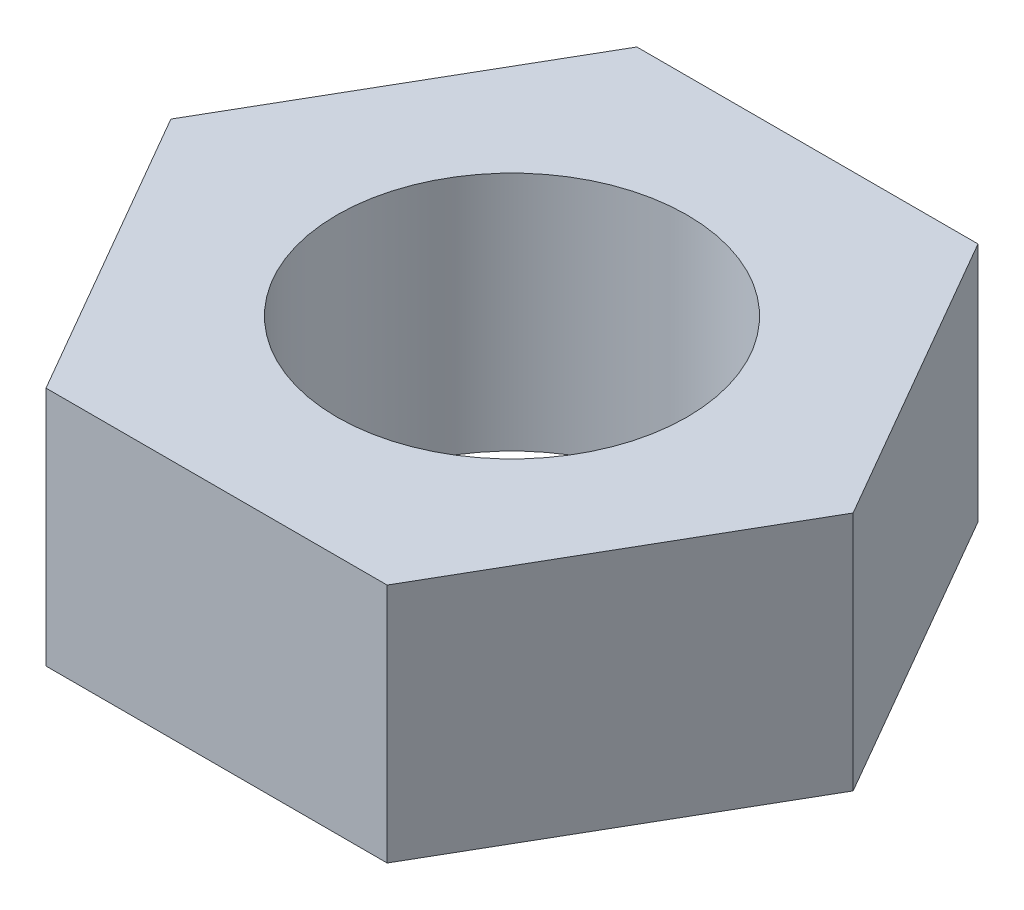
ISO-10303-21;
HEADER;
FILE_DESCRIPTION(('STEP AP214'),'2;1');
FILE_NAME('part.step','',(''),(''),'','','');
FILE_SCHEMA(('AUTOMOTIVE_DESIGN { 1 0 10303 214 1 1 1 1 }'));
ENDSEC;
DATA;
#1=APPLICATION_CONTEXT('core data for automotive mechanical design processes');
#2=APPLICATION_PROTOCOL_DEFINITION('international standard','automotive_design',2000,#1);
#3=PRODUCT_CONTEXT('',#1,'mechanical');
#4=PRODUCT('Part','Part','',(#3));
#5=PRODUCT_RELATED_PRODUCT_CATEGORY('part','',(#4));
#6=PRODUCT_DEFINITION_FORMATION('','',#4);
#7=PRODUCT_DEFINITION_CONTEXT('part definition',#1,'design');
#8=PRODUCT_DEFINITION('design','',#6,#7);
#9=PRODUCT_DEFINITION_SHAPE('','',#8);
#10=(LENGTH_UNIT() NAMED_UNIT(*) SI_UNIT(.MILLI.,.METRE.));
#11=(NAMED_UNIT(*) PLANE_ANGLE_UNIT() SI_UNIT($,.RADIAN.));
#12=(NAMED_UNIT(*) SI_UNIT($,.STERADIAN.) SOLID_ANGLE_UNIT());
#13=UNCERTAINTY_MEASURE_WITH_UNIT(LENGTH_MEASURE(1.E-05),#10,'distance_accuracy_value','');
#14=(GEOMETRIC_REPRESENTATION_CONTEXT(3) GLOBAL_UNCERTAINTY_ASSIGNED_CONTEXT((#13)) GLOBAL_UNIT_ASSIGNED_CONTEXT((#10,
#11,#12)) REPRESENTATION_CONTEXT('',''));
#15=CARTESIAN_POINT('',(0.,0.,0.));
#16=DIRECTION('',(0.,0.,1.));
#17=DIRECTION('',(1.,0.,0.));
#18=AXIS2_PLACEMENT_3D('',#15,#16,#17);
#19=CARTESIAN_POINT('',(0.,5.5,0.));
#20=DIRECTION('',(0.,1.,0.));
#21=DIRECTION('',(0.,0.,1.));
#22=AXIS2_PLACEMENT_3D('',#19,#20,#21);
#23=PLANE('',#22);
#24=DIRECTION('',(0.5,0.,-0.866025403784439));
#25=VECTOR('',#24,1.);
#26=CARTESIAN_POINT('',(3.89711431702997,5.5,6.75));
#27=LINE('',#26,#25);
#28=CARTESIAN_POINT('',(3.89711431702997,5.5,6.75));
#29=VERTEX_POINT('',#28);
#30=CARTESIAN_POINT('',(7.79422863405995,5.5,0.));
#31=VERTEX_POINT('',#30);
#32=EDGE_CURVE('E129',#29,#31,#27,.T.);
#33=ORIENTED_EDGE('',*,*,#32,.T.);
#34=DIRECTION('',(-0.5,0.,-0.866025403784439));
#35=VECTOR('',#34,1.);
#36=CARTESIAN_POINT('',(7.79422863405995,5.5,0.));
#37=LINE('',#36,#35);
#38=CARTESIAN_POINT('',(3.89711431702997,5.5,-6.75));
#39=VERTEX_POINT('',#38);
#40=EDGE_CURVE('E87',#31,#39,#37,.T.);
#41=ORIENTED_EDGE('',*,*,#40,.T.);
#42=DIRECTION('',(-1.,0.,0.));
#43=VECTOR('',#42,1.);
#44=CARTESIAN_POINT('',(3.89711431702997,5.5,-6.75));
#45=LINE('',#44,#43);
#46=CARTESIAN_POINT('',(-3.89711431702998,5.5,-6.75));
#47=VERTEX_POINT('',#46);
#48=EDGE_CURVE('E100',#39,#47,#45,.T.);
#49=ORIENTED_EDGE('',*,*,#48,.T.);
#50=DIRECTION('',(-0.5,0.,0.866025403784439));
#51=VECTOR('',#50,1.);
#52=CARTESIAN_POINT('',(-3.89711431702998,5.5,-6.75));
#53=LINE('',#52,#51);
#54=CARTESIAN_POINT('',(-7.79422863405995,5.5,0.));
#55=VERTEX_POINT('',#54);
#56=EDGE_CURVE('E94',#47,#55,#53,.T.);
#57=ORIENTED_EDGE('',*,*,#56,.T.);
#58=DIRECTION('',(0.5,0.,0.866025403784439));
#59=VECTOR('',#58,1.);
#60=CARTESIAN_POINT('',(-7.79422863405995,5.5,0.));
#61=LINE('',#60,#59);
#62=CARTESIAN_POINT('',(-3.89711431702997,5.5,6.75));
#63=VERTEX_POINT('',#62);
#64=EDGE_CURVE('E98',#55,#63,#61,.T.);
#65=ORIENTED_EDGE('',*,*,#64,.T.);
#66=DIRECTION('',(1.,0.,0.));
#67=VECTOR('',#66,1.);
#68=CARTESIAN_POINT('',(-3.89711431702997,5.5,6.75));
#69=LINE('',#68,#67);
#70=EDGE_CURVE('E50',#63,#29,#69,.T.);
#71=ORIENTED_EDGE('',*,*,#70,.T.);
#72=EDGE_LOOP('',(#33,#41,#49,#57,#65,#71));
#73=FACE_BOUND('',#72,.T.);
#74=CARTESIAN_POINT('',(0.,5.5,0.));
#75=DIRECTION('',(0.,1.,0.));
#76=DIRECTION('',(0.,0.,1.));
#77=AXIS2_PLACEMENT_3D('',#74,#75,#76);
#78=CIRCLE('',#77,4.);
#79=CARTESIAN_POINT('',(0.,5.5,4.));
#80=VERTEX_POINT('',#79);
#81=EDGE_CURVE('E122',#80,#80,#78,.T.);
#82=ORIENTED_EDGE('',*,*,#81,.F.);
#83=EDGE_LOOP('',(#82));
#84=FACE_BOUND('',#83,.T.);
#85=ADVANCED_FACE('F33',(#73,#84),#23,.T.);
#86=CARTESIAN_POINT('',(0.,0.,0.));
#87=DIRECTION('',(0.,1.,0.));
#88=DIRECTION('',(0.,0.,1.));
#89=AXIS2_PLACEMENT_3D('',#86,#87,#88);
#90=PLANE('',#89);
#91=DIRECTION('',(0.5,0.,-0.866025403784439));
#92=VECTOR('',#91,1.);
#93=CARTESIAN_POINT('',(3.89711431702997,0.,6.75));
#94=LINE('',#93,#92);
#95=CARTESIAN_POINT('',(3.89711431702997,0.,6.75));
#96=VERTEX_POINT('',#95);
#97=CARTESIAN_POINT('',(7.79422863405995,0.,0.));
#98=VERTEX_POINT('',#97);
#99=EDGE_CURVE('E118',#96,#98,#94,.T.);
#100=ORIENTED_EDGE('',*,*,#99,.F.);
#101=DIRECTION('',(1.,0.,0.));
#102=VECTOR('',#101,1.);
#103=CARTESIAN_POINT('',(-3.89711431702997,0.,6.75));
#104=LINE('',#103,#102);
#105=CARTESIAN_POINT('',(-3.89711431702997,0.,6.75));
#106=VERTEX_POINT('',#105);
#107=EDGE_CURVE('E79',#106,#96,#104,.T.);
#108=ORIENTED_EDGE('',*,*,#107,.F.);
#109=DIRECTION('',(0.5,0.,0.866025403784439));
#110=VECTOR('',#109,1.);
#111=CARTESIAN_POINT('',(-7.79422863405995,0.,0.));
#112=LINE('',#111,#110);
#113=CARTESIAN_POINT('',(-7.79422863405995,0.,0.));
#114=VERTEX_POINT('',#113);
#115=EDGE_CURVE('E73',#114,#106,#112,.T.);
#116=ORIENTED_EDGE('',*,*,#115,.F.);
#117=DIRECTION('',(-0.5,0.,0.866025403784439));
#118=VECTOR('',#117,1.);
#119=CARTESIAN_POINT('',(-3.89711431702998,0.,-6.75));
#120=LINE('',#119,#118);
#121=CARTESIAN_POINT('',(-3.89711431702998,0.,-6.75));
#122=VERTEX_POINT('',#121);
#123=EDGE_CURVE('E108',#122,#114,#120,.T.);
#124=ORIENTED_EDGE('',*,*,#123,.F.);
#125=DIRECTION('',(-1.,0.,0.));
#126=VECTOR('',#125,1.);
#127=CARTESIAN_POINT('',(3.89711431702997,0.,-6.75));
#128=LINE('',#127,#126);
#129=CARTESIAN_POINT('',(3.89711431702997,0.,-6.75));
#130=VERTEX_POINT('',#129);
#131=EDGE_CURVE('E124',#130,#122,#128,.T.);
#132=ORIENTED_EDGE('',*,*,#131,.F.);
#133=DIRECTION('',(-0.5,0.,-0.866025403784439));
#134=VECTOR('',#133,1.);
#135=CARTESIAN_POINT('',(7.79422863405995,0.,0.));
#136=LINE('',#135,#134);
#137=EDGE_CURVE('E121',#98,#130,#136,.T.);
#138=ORIENTED_EDGE('',*,*,#137,.F.);
#139=EDGE_LOOP('',(#100,#108,#116,#124,#132,#138));
#140=FACE_BOUND('',#139,.T.);
#141=CARTESIAN_POINT('',(0.,0.,0.));
#142=DIRECTION('',(0.,1.,0.));
#143=DIRECTION('',(0.,0.,1.));
#144=AXIS2_PLACEMENT_3D('',#141,#142,#143);
#145=CIRCLE('',#144,4.);
#146=CARTESIAN_POINT('',(0.,0.,4.));
#147=VERTEX_POINT('',#146);
#148=EDGE_CURVE('E222',#147,#147,#145,.T.);
#149=ORIENTED_EDGE('',*,*,#148,.T.);
#150=EDGE_LOOP('',(#149));
#151=FACE_BOUND('',#150,.T.);
#152=ADVANCED_FACE('F138',(#140,#151),#90,.F.);
#153=CARTESIAN_POINT('',(3.89711431702997,5.5,6.75));
#154=DIRECTION('',(-0.866025403784439,0.,-0.5));
#155=DIRECTION('',(-0.5,0.,0.866025403784439));
#156=AXIS2_PLACEMENT_3D('',#153,#154,#155);
#157=PLANE('',#156);
#158=ORIENTED_EDGE('',*,*,#99,.T.);
#159=DIRECTION('',(0.,-1.,0.));
#160=VECTOR('',#159,1.);
#161=CARTESIAN_POINT('',(7.79422863405995,5.5,0.));
#162=LINE('',#161,#160);
#163=EDGE_CURVE('E11',#31,#98,#162,.T.);
#164=ORIENTED_EDGE('',*,*,#163,.F.);
#165=ORIENTED_EDGE('',*,*,#32,.F.);
#166=DIRECTION('',(0.,-1.,0.));
#167=VECTOR('',#166,1.);
#168=CARTESIAN_POINT('',(3.89711431702997,5.5,6.75));
#169=LINE('',#168,#167);
#170=EDGE_CURVE('E114',#29,#96,#169,.T.);
#171=ORIENTED_EDGE('',*,*,#170,.T.);
#172=EDGE_LOOP('',(#158,#164,#165,#171));
#173=FACE_BOUND('',#172,.T.);
#174=ADVANCED_FACE('F35',(#173),#157,.F.);
#175=CARTESIAN_POINT('',(7.79422863405995,5.5,0.));
#176=DIRECTION('',(-0.866025403784438,0.,0.5));
#177=DIRECTION('',(0.5,0.,0.866025403784439));
#178=AXIS2_PLACEMENT_3D('',#175,#176,#177);
#179=PLANE('',#178);
#180=ORIENTED_EDGE('',*,*,#137,.T.);
#181=DIRECTION('',(0.,-1.,0.));
#182=VECTOR('',#181,1.);
#183=CARTESIAN_POINT('',(3.89711431702997,5.5,-6.75));
#184=LINE('',#183,#182);
#185=EDGE_CURVE('E42',#39,#130,#184,.T.);
#186=ORIENTED_EDGE('',*,*,#185,.F.);
#187=ORIENTED_EDGE('',*,*,#40,.F.);
#188=ORIENTED_EDGE('',*,*,#163,.T.);
#189=EDGE_LOOP('',(#180,#186,#187,#188));
#190=FACE_BOUND('',#189,.T.);
#191=ADVANCED_FACE('F163',(#190),#179,.F.);
#192=CARTESIAN_POINT('',(3.89711431702997,5.5,-6.75));
#193=DIRECTION('',(0.,0.,1.));
#194=DIRECTION('',(1.,0.,0.));
#195=AXIS2_PLACEMENT_3D('',#192,#193,#194);
#196=PLANE('',#195);
#197=ORIENTED_EDGE('',*,*,#131,.T.);
#198=DIRECTION('',(0.,-1.,0.));
#199=VECTOR('',#198,1.);
#200=CARTESIAN_POINT('',(-3.89711431702998,5.5,-6.75));
#201=LINE('',#200,#199);
#202=EDGE_CURVE('E109',#47,#122,#201,.T.);
#203=ORIENTED_EDGE('',*,*,#202,.F.);
#204=ORIENTED_EDGE('',*,*,#48,.F.);
#205=ORIENTED_EDGE('',*,*,#185,.T.);
#206=EDGE_LOOP('',(#197,#203,#204,#205));
#207=FACE_BOUND('',#206,.T.);
#208=ADVANCED_FACE('F135',(#207),#196,.F.);
#209=CARTESIAN_POINT('',(-3.89711431702998,5.5,-6.75));
#210=DIRECTION('',(0.866025403784439,0.,0.5));
#211=DIRECTION('',(0.5,0.,-0.866025403784439));
#212=AXIS2_PLACEMENT_3D('',#209,#210,#211);
#213=PLANE('',#212);
#214=ORIENTED_EDGE('',*,*,#123,.T.);
#215=DIRECTION('',(0.,-1.,0.));
#216=VECTOR('',#215,1.);
#217=CARTESIAN_POINT('',(-7.79422863405995,5.5,0.));
#218=LINE('',#217,#216);
#219=EDGE_CURVE('E105',#55,#114,#218,.T.);
#220=ORIENTED_EDGE('',*,*,#219,.F.);
#221=ORIENTED_EDGE('',*,*,#56,.F.);
#222=ORIENTED_EDGE('',*,*,#202,.T.);
#223=EDGE_LOOP('',(#214,#220,#221,#222));
#224=FACE_BOUND('',#223,.T.);
#225=ADVANCED_FACE('F106',(#224),#213,.F.);
#226=CARTESIAN_POINT('',(-7.79422863405995,5.5,0.));
#227=DIRECTION('',(0.866025403784439,0.,-0.5));
#228=DIRECTION('',(-0.5,0.,-0.866025403784439));
#229=AXIS2_PLACEMENT_3D('',#226,#227,#228);
#230=PLANE('',#229);
#231=ORIENTED_EDGE('',*,*,#115,.T.);
#232=DIRECTION('',(0.,-1.,0.));
#233=VECTOR('',#232,1.);
#234=CARTESIAN_POINT('',(-3.89711431702997,5.5,6.75));
#235=LINE('',#234,#233);
#236=EDGE_CURVE('E110',#63,#106,#235,.T.);
#237=ORIENTED_EDGE('',*,*,#236,.F.);
#238=ORIENTED_EDGE('',*,*,#64,.F.);
#239=ORIENTED_EDGE('',*,*,#219,.T.);
#240=EDGE_LOOP('',(#231,#237,#238,#239));
#241=FACE_BOUND('',#240,.T.);
#242=ADVANCED_FACE('F112',(#241),#230,.F.);
#243=CARTESIAN_POINT('',(-3.89711431702997,5.5,6.75));
#244=DIRECTION('',(0.,0.,-1.));
#245=DIRECTION('',(-1.,0.,0.));
#246=AXIS2_PLACEMENT_3D('',#243,#244,#245);
#247=PLANE('',#246);
#248=ORIENTED_EDGE('',*,*,#107,.T.);
#249=ORIENTED_EDGE('',*,*,#170,.F.);
#250=ORIENTED_EDGE('',*,*,#70,.F.);
#251=ORIENTED_EDGE('',*,*,#236,.T.);
#252=EDGE_LOOP('',(#248,#249,#250,#251));
#253=FACE_BOUND('',#252,.T.);
#254=ADVANCED_FACE('F143',(#253),#247,.F.);
#255=CARTESIAN_POINT('',(0.,5.5,0.));
#256=DIRECTION('',(0.,-1.,0.));
#257=DIRECTION('',(0.,0.,-1.));
#258=AXIS2_PLACEMENT_3D('',#255,#256,#257);
#259=CYLINDRICAL_SURFACE('',#258,4.);
#260=ORIENTED_EDGE('',*,*,#81,.T.);
#261=EDGE_LOOP('',(#260));
#262=FACE_BOUND('',#261,.T.);
#263=ORIENTED_EDGE('',*,*,#148,.F.);
#264=EDGE_LOOP('',(#263));
#265=FACE_BOUND('',#264,.T.);
#266=ADVANCED_FACE('F145',(#262,#265),#259,.F.);
#267=CLOSED_SHELL('',(#85,#152,#174,#191,#208,#225,#242,#254,#266));
#268=MANIFOLD_SOLID_BREP('B2',#267);
#269=ADVANCED_BREP_SHAPE_REPRESENTATION('',(#18,#268),#14);
#270=SHAPE_DEFINITION_REPRESENTATION(#9,#269);
ENDSEC;
END-ISO-10303-21;
